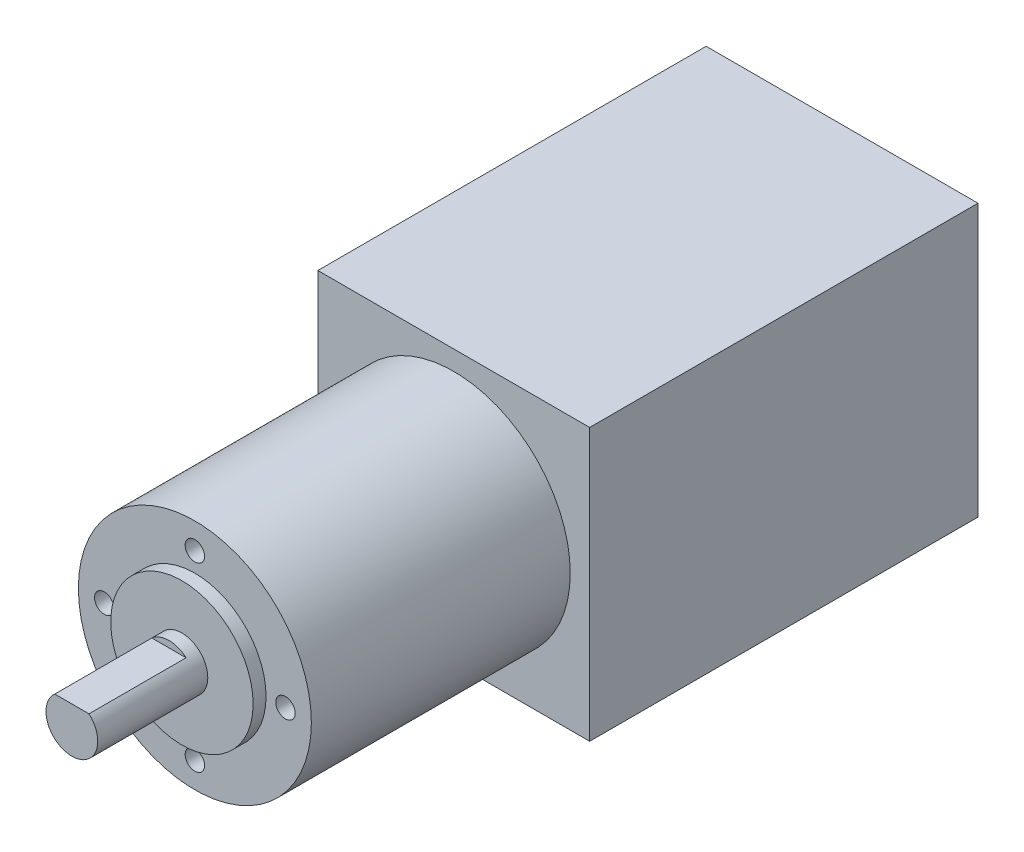
ISO-10303-21;
HEADER;
FILE_DESCRIPTION(('STEP AP214'),'2;1');
FILE_NAME('part.step','',(''),(''),'','','');
FILE_SCHEMA(('AUTOMOTIVE_DESIGN { 1 0 10303 214 1 1 1 1 }'));
ENDSEC;
DATA;
#1=APPLICATION_CONTEXT('core data for automotive mechanical design processes');
#2=APPLICATION_PROTOCOL_DEFINITION('international standard','automotive_design',2000,#1);
#3=PRODUCT_CONTEXT('',#1,'mechanical');
#4=PRODUCT('Part','Part','',(#3));
#5=PRODUCT_RELATED_PRODUCT_CATEGORY('part','',(#4));
#6=PRODUCT_DEFINITION_FORMATION('','',#4);
#7=PRODUCT_DEFINITION_CONTEXT('part definition',#1,'design');
#8=PRODUCT_DEFINITION('design','',#6,#7);
#9=PRODUCT_DEFINITION_SHAPE('','',#8);
#10=(LENGTH_UNIT() NAMED_UNIT(*) SI_UNIT(.MILLI.,.METRE.));
#11=(NAMED_UNIT(*) PLANE_ANGLE_UNIT() SI_UNIT($,.RADIAN.));
#12=(NAMED_UNIT(*) SI_UNIT($,.STERADIAN.) SOLID_ANGLE_UNIT());
#13=UNCERTAINTY_MEASURE_WITH_UNIT(LENGTH_MEASURE(1.E-05),#10,'distance_accuracy_value','');
#14=(GEOMETRIC_REPRESENTATION_CONTEXT(3) GLOBAL_UNCERTAINTY_ASSIGNED_CONTEXT((#13)) GLOBAL_UNIT_ASSIGNED_CONTEXT((#10,
#11,#12)) REPRESENTATION_CONTEXT('',''));
#15=CARTESIAN_POINT('',(0.,0.,0.));
#16=DIRECTION('',(0.,0.,1.));
#17=DIRECTION('',(1.,0.,0.));
#18=AXIS2_PLACEMENT_3D('',#15,#16,#17);
#19=CARTESIAN_POINT('',(21.,21.,60.));
#20=DIRECTION('',(-1.,0.,0.));
#21=DIRECTION('',(0.,-1.,0.));
#22=AXIS2_PLACEMENT_3D('',#19,#20,#21);
#23=PLANE('',#22);
#24=DIRECTION('',(0.,1.,0.));
#25=VECTOR('',#24,1.);
#26=CARTESIAN_POINT('',(21.,21.,0.));
#27=LINE('',#26,#25);
#28=CARTESIAN_POINT('',(21.,-21.,0.));
#29=VERTEX_POINT('',#28);
#30=CARTESIAN_POINT('',(21.,21.,0.));
#31=VERTEX_POINT('',#30);
#32=EDGE_CURVE('E154',#29,#31,#27,.T.);
#33=ORIENTED_EDGE('',*,*,#32,.T.);
#34=DIRECTION('',(0.,0.,-1.));
#35=VECTOR('',#34,1.);
#36=CARTESIAN_POINT('',(21.,21.,60.));
#37=LINE('',#36,#35);
#38=CARTESIAN_POINT('',(21.,21.,60.));
#39=VERTEX_POINT('',#38);
#40=EDGE_CURVE('E39',#39,#31,#37,.T.);
#41=ORIENTED_EDGE('',*,*,#40,.F.);
#42=DIRECTION('',(0.,1.,0.));
#43=VECTOR('',#42,1.);
#44=CARTESIAN_POINT('',(21.,21.,60.));
#45=LINE('',#44,#43);
#46=CARTESIAN_POINT('',(21.,-21.,60.));
#47=VERTEX_POINT('',#46);
#48=EDGE_CURVE('E157',#47,#39,#45,.T.);
#49=ORIENTED_EDGE('',*,*,#48,.F.);
#50=DIRECTION('',(0.,0.,-1.));
#51=VECTOR('',#50,1.);
#52=CARTESIAN_POINT('',(21.,-21.,60.));
#53=LINE('',#52,#51);
#54=EDGE_CURVE('E163',#47,#29,#53,.T.);
#55=ORIENTED_EDGE('',*,*,#54,.T.);
#56=EDGE_LOOP('',(#33,#41,#49,#55));
#57=FACE_BOUND('',#56,.T.);
#58=ADVANCED_FACE('F36',(#57),#23,.F.);
#59=CARTESIAN_POINT('',(-21.,21.,60.));
#60=DIRECTION('',(0.,-1.,0.));
#61=DIRECTION('',(0.,0.,-1.));
#62=AXIS2_PLACEMENT_3D('',#59,#60,#61);
#63=PLANE('',#62);
#64=DIRECTION('',(-1.,0.,0.));
#65=VECTOR('',#64,1.);
#66=CARTESIAN_POINT('',(-21.,21.,0.));
#67=LINE('',#66,#65);
#68=CARTESIAN_POINT('',(-21.,21.,0.));
#69=VERTEX_POINT('',#68);
#70=EDGE_CURVE('E166',#31,#69,#67,.T.);
#71=ORIENTED_EDGE('',*,*,#70,.T.);
#72=DIRECTION('',(0.,0.,-1.));
#73=VECTOR('',#72,1.);
#74=CARTESIAN_POINT('',(-21.,21.,60.));
#75=LINE('',#74,#73);
#76=CARTESIAN_POINT('',(-21.,21.,60.));
#77=VERTEX_POINT('',#76);
#78=EDGE_CURVE('E173',#77,#69,#75,.T.);
#79=ORIENTED_EDGE('',*,*,#78,.F.);
#80=DIRECTION('',(-1.,0.,0.));
#81=VECTOR('',#80,1.);
#82=CARTESIAN_POINT('',(-21.,21.,60.));
#83=LINE('',#82,#81);
#84=EDGE_CURVE('E90',#39,#77,#83,.T.);
#85=ORIENTED_EDGE('',*,*,#84,.F.);
#86=ORIENTED_EDGE('',*,*,#40,.T.);
#87=EDGE_LOOP('',(#71,#79,#85,#86));
#88=FACE_BOUND('',#87,.T.);
#89=ADVANCED_FACE('F179',(#88),#63,.F.);
#90=CARTESIAN_POINT('',(-21.,21.,60.));
#91=DIRECTION('',(1.,0.,0.));
#92=DIRECTION('',(0.,1.,0.));
#93=AXIS2_PLACEMENT_3D('',#90,#91,#92);
#94=PLANE('',#93);
#95=DIRECTION('',(0.,-1.,0.));
#96=VECTOR('',#95,1.);
#97=CARTESIAN_POINT('',(-21.,21.,0.));
#98=LINE('',#97,#96);
#99=CARTESIAN_POINT('',(-21.,-21.,0.));
#100=VERTEX_POINT('',#99);
#101=EDGE_CURVE('E168',#69,#100,#98,.T.);
#102=ORIENTED_EDGE('',*,*,#101,.T.);
#103=DIRECTION('',(0.,0.,-1.));
#104=VECTOR('',#103,1.);
#105=CARTESIAN_POINT('',(-21.,-21.,60.));
#106=LINE('',#105,#104);
#107=CARTESIAN_POINT('',(-21.,-21.,60.));
#108=VERTEX_POINT('',#107);
#109=EDGE_CURVE('E172',#108,#100,#106,.T.);
#110=ORIENTED_EDGE('',*,*,#109,.F.);
#111=DIRECTION('',(0.,-1.,0.));
#112=VECTOR('',#111,1.);
#113=CARTESIAN_POINT('',(-21.,21.,60.));
#114=LINE('',#113,#112);
#115=EDGE_CURVE('E160',#77,#108,#114,.T.);
#116=ORIENTED_EDGE('',*,*,#115,.F.);
#117=ORIENTED_EDGE('',*,*,#78,.T.);
#118=EDGE_LOOP('',(#102,#110,#116,#117));
#119=FACE_BOUND('',#118,.T.);
#120=ADVANCED_FACE('F186',(#119),#94,.F.);
#121=CARTESIAN_POINT('',(-21.,-21.,60.));
#122=DIRECTION('',(0.,1.,0.));
#123=DIRECTION('',(0.,0.,1.));
#124=AXIS2_PLACEMENT_3D('',#121,#122,#123);
#125=PLANE('',#124);
#126=DIRECTION('',(1.,0.,0.));
#127=VECTOR('',#126,1.);
#128=CARTESIAN_POINT('',(-21.,-21.,0.));
#129=LINE('',#128,#127);
#130=EDGE_CURVE('E82',#100,#29,#129,.T.);
#131=ORIENTED_EDGE('',*,*,#130,.T.);
#132=ORIENTED_EDGE('',*,*,#54,.F.);
#133=DIRECTION('',(1.,0.,0.));
#134=VECTOR('',#133,1.);
#135=CARTESIAN_POINT('',(-21.,-21.,60.));
#136=LINE('',#135,#134);
#137=EDGE_CURVE('E61',#108,#47,#136,.T.);
#138=ORIENTED_EDGE('',*,*,#137,.F.);
#139=ORIENTED_EDGE('',*,*,#109,.T.);
#140=EDGE_LOOP('',(#131,#132,#138,#139));
#141=FACE_BOUND('',#140,.T.);
#142=ADVANCED_FACE('F187',(#141),#125,.F.);
#143=CARTESIAN_POINT('',(0.,0.,60.));
#144=DIRECTION('',(0.,0.,1.));
#145=DIRECTION('',(1.,0.,0.));
#146=AXIS2_PLACEMENT_3D('',#143,#144,#145);
#147=PLANE('',#146);
#148=CARTESIAN_POINT('',(0.,0.,60.));
#149=DIRECTION('',(0.,0.,1.));
#150=DIRECTION('',(1.,0.,0.));
#151=AXIS2_PLACEMENT_3D('',#148,#149,#150);
#152=CIRCLE('',#151,18.);
#153=CARTESIAN_POINT('',(18.,0.,60.));
#154=VERTEX_POINT('',#153);
#155=EDGE_CURVE('E151',#154,#154,#152,.T.);
#156=ORIENTED_EDGE('',*,*,#155,.F.);
#157=EDGE_LOOP('',(#156));
#158=FACE_BOUND('',#157,.T.);
#159=ORIENTED_EDGE('',*,*,#48,.T.);
#160=ORIENTED_EDGE('',*,*,#84,.T.);
#161=ORIENTED_EDGE('',*,*,#115,.T.);
#162=ORIENTED_EDGE('',*,*,#137,.T.);
#163=EDGE_LOOP('',(#159,#160,#161,#162));
#164=FACE_BOUND('',#163,.T.);
#165=ADVANCED_FACE('F188',(#158,#164),#147,.T.);
#166=CARTESIAN_POINT('',(0.,0.,0.));
#167=DIRECTION('',(0.,0.,1.));
#168=DIRECTION('',(1.,0.,0.));
#169=AXIS2_PLACEMENT_3D('',#166,#167,#168);
#170=PLANE('',#169);
#171=ORIENTED_EDGE('',*,*,#32,.F.);
#172=ORIENTED_EDGE('',*,*,#130,.F.);
#173=ORIENTED_EDGE('',*,*,#101,.F.);
#174=ORIENTED_EDGE('',*,*,#70,.F.);
#175=EDGE_LOOP('',(#171,#172,#173,#174));
#176=FACE_BOUND('',#175,.T.);
#177=ADVANCED_FACE('F184',(#176),#170,.F.);
#178=CARTESIAN_POINT('',(0.,0.,100.));
#179=DIRECTION('',(0.,0.,-1.));
#180=DIRECTION('',(-1.,0.,0.));
#181=AXIS2_PLACEMENT_3D('',#178,#179,#180);
#182=CYLINDRICAL_SURFACE('',#181,18.);
#183=CARTESIAN_POINT('',(0.,0.,100.));
#184=DIRECTION('',(0.,0.,1.));
#185=DIRECTION('',(1.,0.,0.));
#186=AXIS2_PLACEMENT_3D('',#183,#184,#185);
#187=CIRCLE('',#186,18.);
#188=CARTESIAN_POINT('',(18.,0.,100.));
#189=VERTEX_POINT('',#188);
#190=EDGE_CURVE('E148',#189,#189,#187,.T.);
#191=ORIENTED_EDGE('',*,*,#190,.F.);
#192=EDGE_LOOP('',(#191));
#193=FACE_BOUND('',#192,.T.);
#194=ORIENTED_EDGE('',*,*,#155,.T.);
#195=EDGE_LOOP('',(#194));
#196=FACE_BOUND('',#195,.T.);
#197=ADVANCED_FACE('F196',(#193,#196),#182,.T.);
#198=CARTESIAN_POINT('',(0.,0.,100.));
#199=DIRECTION('',(0.,0.,1.));
#200=DIRECTION('',(1.,0.,0.));
#201=AXIS2_PLACEMENT_3D('',#198,#199,#200);
#202=PLANE('',#201);
#203=CARTESIAN_POINT('',(0.,14.,100.));
#204=DIRECTION('',(0.,0.,1.));
#205=DIRECTION('',(1.,0.,0.));
#206=AXIS2_PLACEMENT_3D('',#203,#204,#205);
#207=CIRCLE('',#206,1.5);
#208=CARTESIAN_POINT('',(1.5,14.,100.));
#209=VERTEX_POINT('',#208);
#210=EDGE_CURVE('E124',#209,#209,#207,.T.);
#211=ORIENTED_EDGE('',*,*,#210,.F.);
#212=EDGE_LOOP('',(#211));
#213=FACE_BOUND('',#212,.T.);
#214=CARTESIAN_POINT('',(14.0000000000004,3.95332173747447E-13,100.));
#215=DIRECTION('',(0.,0.,1.));
#216=DIRECTION('',(1.,0.,0.));
#217=AXIS2_PLACEMENT_3D('',#214,#215,#216);
#218=CIRCLE('',#217,1.50000000000031);
#219=CARTESIAN_POINT('',(15.5000000000007,3.95332173747447E-13,100.));
#220=VERTEX_POINT('',#219);
#221=EDGE_CURVE('E130',#220,#220,#218,.T.);
#222=ORIENTED_EDGE('',*,*,#221,.F.);
#223=EDGE_LOOP('',(#222));
#224=FACE_BOUND('',#223,.T.);
#225=CARTESIAN_POINT('',(7.90664347494893E-13,-14.,100.));
#226=DIRECTION('',(0.,0.,1.));
#227=DIRECTION('',(1.,0.,0.));
#228=AXIS2_PLACEMENT_3D('',#225,#226,#227);
#229=CIRCLE('',#228,1.50000000000085);
#230=CARTESIAN_POINT('',(1.50000000000164,-14.,100.));
#231=VERTEX_POINT('',#230);
#232=EDGE_CURVE('E136',#231,#231,#229,.T.);
#233=ORIENTED_EDGE('',*,*,#232,.F.);
#234=EDGE_LOOP('',(#233));
#235=FACE_BOUND('',#234,.T.);
#236=CARTESIAN_POINT('',(-13.9999999999996,-3.97046679266253E-13,100.));
#237=DIRECTION('',(0.,0.,1.));
#238=DIRECTION('',(1.,0.,0.));
#239=AXIS2_PLACEMENT_3D('',#236,#237,#238);
#240=CIRCLE('',#239,1.50000000000064);
#241=CARTESIAN_POINT('',(-12.499999999999,-3.97046679266253E-13,100.));
#242=VERTEX_POINT('',#241);
#243=EDGE_CURVE('E117',#242,#242,#240,.T.);
#244=ORIENTED_EDGE('',*,*,#243,.F.);
#245=EDGE_LOOP('',(#244));
#246=FACE_BOUND('',#245,.T.);
#247=CARTESIAN_POINT('',(0.,0.,100.));
#248=DIRECTION('',(0.,0.,1.));
#249=DIRECTION('',(1.,0.,0.));
#250=AXIS2_PLACEMENT_3D('',#247,#248,#249);
#251=CIRCLE('',#250,11.);
#252=CARTESIAN_POINT('',(11.,0.,100.));
#253=VERTEX_POINT('',#252);
#254=EDGE_CURVE('E44',#253,#253,#251,.T.);
#255=ORIENTED_EDGE('',*,*,#254,.F.);
#256=EDGE_LOOP('',(#255));
#257=FACE_BOUND('',#256,.T.);
#258=ORIENTED_EDGE('',*,*,#190,.T.);
#259=EDGE_LOOP('',(#258));
#260=FACE_BOUND('',#259,.T.);
#261=ADVANCED_FACE('F234',(#213,#224,#235,#246,#257,#260),#202,.T.);
#262=CARTESIAN_POINT('',(0.,0.,102.));
#263=DIRECTION('',(0.,0.,-1.));
#264=DIRECTION('',(-1.,0.,0.));
#265=AXIS2_PLACEMENT_3D('',#262,#263,#264);
#266=CYLINDRICAL_SURFACE('',#265,11.);
#267=CARTESIAN_POINT('',(0.,0.,102.));
#268=DIRECTION('',(0.,0.,1.));
#269=DIRECTION('',(1.,0.,0.));
#270=AXIS2_PLACEMENT_3D('',#267,#268,#269);
#271=CIRCLE('',#270,11.);
#272=CARTESIAN_POINT('',(11.,0.,102.));
#273=VERTEX_POINT('',#272);
#274=EDGE_CURVE('E144',#273,#273,#271,.T.);
#275=ORIENTED_EDGE('',*,*,#274,.F.);
#276=EDGE_LOOP('',(#275));
#277=FACE_BOUND('',#276,.T.);
#278=ORIENTED_EDGE('',*,*,#254,.T.);
#279=EDGE_LOOP('',(#278));
#280=FACE_BOUND('',#279,.T.);
#281=ADVANCED_FACE('F241',(#277,#280),#266,.T.);
#282=CARTESIAN_POINT('',(0.,0.,102.));
#283=DIRECTION('',(0.,0.,1.));
#284=DIRECTION('',(1.,0.,0.));
#285=AXIS2_PLACEMENT_3D('',#282,#283,#284);
#286=PLANE('',#285);
#287=CARTESIAN_POINT('',(0.,0.,102.));
#288=DIRECTION('',(0.,0.,1.));
#289=DIRECTION('',(1.,0.,0.));
#290=AXIS2_PLACEMENT_3D('',#287,#288,#289);
#291=CIRCLE('',#290,4.);
#292=CARTESIAN_POINT('',(4.,0.,102.));
#293=VERTEX_POINT('',#292);
#294=EDGE_CURVE('E11',#293,#293,#291,.T.);
#295=ORIENTED_EDGE('',*,*,#294,.F.);
#296=EDGE_LOOP('',(#295));
#297=FACE_BOUND('',#296,.T.);
#298=ORIENTED_EDGE('',*,*,#274,.T.);
#299=EDGE_LOOP('',(#298));
#300=FACE_BOUND('',#299,.T.);
#301=ADVANCED_FACE('F246',(#297,#300),#286,.T.);
#302=CARTESIAN_POINT('',(0.,0.,119.));
#303=DIRECTION('',(0.,0.,-1.));
#304=DIRECTION('',(-1.,0.,0.));
#305=AXIS2_PLACEMENT_3D('',#302,#303,#304);
#306=CYLINDRICAL_SURFACE('',#305,4.);
#307=CARTESIAN_POINT('',(0.,0.,119.));
#308=DIRECTION('',(0.,0.,1.));
#309=DIRECTION('',(1.,0.,0.));
#310=AXIS2_PLACEMENT_3D('',#307,#308,#309);
#311=CIRCLE('',#310,4.);
#312=CARTESIAN_POINT('',(-2.64575131106459,3.,119.));
#313=VERTEX_POINT('',#312);
#314=CARTESIAN_POINT('',(2.64575131106459,3.,119.));
#315=VERTEX_POINT('',#314);
#316=EDGE_CURVE('E115',#313,#315,#311,.T.);
#317=ORIENTED_EDGE('',*,*,#316,.F.);
#318=DIRECTION('',(0.,0.,1.));
#319=VECTOR('',#318,1.);
#320=CARTESIAN_POINT('',(-2.64575131106459,3.,104.));
#321=LINE('',#320,#319);
#322=CARTESIAN_POINT('',(-2.64575131106459,3.,104.));
#323=VERTEX_POINT('',#322);
#324=EDGE_CURVE('E52',#323,#313,#321,.T.);
#325=ORIENTED_EDGE('',*,*,#324,.F.);
#326=CARTESIAN_POINT('',(0.,0.,104.));
#327=DIRECTION('',(0.,0.,1.));
#328=DIRECTION('',(-1.,0.,0.));
#329=AXIS2_PLACEMENT_3D('',#326,#327,#328);
#330=CIRCLE('',#329,4.);
#331=CARTESIAN_POINT('',(2.64575131106459,3.,104.));
#332=VERTEX_POINT('',#331);
#333=EDGE_CURVE('E101',#332,#323,#330,.T.);
#334=ORIENTED_EDGE('',*,*,#333,.F.);
#335=DIRECTION('',(0.,0.,1.));
#336=VECTOR('',#335,1.);
#337=CARTESIAN_POINT('',(2.64575131106459,3.,104.));
#338=LINE('',#337,#336);
#339=EDGE_CURVE('E109',#332,#315,#338,.T.);
#340=ORIENTED_EDGE('',*,*,#339,.T.);
#341=EDGE_LOOP('',(#317,#325,#334,#340));
#342=FACE_BOUND('',#341,.T.);
#343=ORIENTED_EDGE('',*,*,#294,.T.);
#344=EDGE_LOOP('',(#343));
#345=FACE_BOUND('',#344,.T.);
#346=ADVANCED_FACE('F112',(#342,#345),#306,.T.);
#347=CARTESIAN_POINT('',(0.,0.,119.));
#348=DIRECTION('',(0.,0.,1.));
#349=DIRECTION('',(1.,0.,0.));
#350=AXIS2_PLACEMENT_3D('',#347,#348,#349);
#351=PLANE('',#350);
#352=DIRECTION('',(1.,0.,0.));
#353=VECTOR('',#352,1.);
#354=CARTESIAN_POINT('',(2.64575131106459,3.,119.));
#355=LINE('',#354,#353);
#356=EDGE_CURVE('E106',#313,#315,#355,.T.);
#357=ORIENTED_EDGE('',*,*,#356,.F.);
#358=ORIENTED_EDGE('',*,*,#316,.T.);
#359=EDGE_LOOP('',(#357,#358));
#360=FACE_BOUND('',#359,.T.);
#361=ADVANCED_FACE('F276',(#360),#351,.T.);
#362=CARTESIAN_POINT('',(-13.9999999999996,-3.97046679266253E-13,96.));
#363=DIRECTION('',(0.,0.,1.));
#364=DIRECTION('',(1.,0.,0.));
#365=AXIS2_PLACEMENT_3D('',#362,#363,#364);
#366=CYLINDRICAL_SURFACE('',#365,1.50000000000064);
#367=CARTESIAN_POINT('',(-13.9999999999996,-3.97046679266253E-13,96.));
#368=DIRECTION('',(0.,0.,1.));
#369=DIRECTION('',(1.,0.,0.));
#370=AXIS2_PLACEMENT_3D('',#367,#368,#369);
#371=CIRCLE('',#370,1.50000000000064);
#372=CARTESIAN_POINT('',(-12.499999999999,-3.97046679266253E-13,96.));
#373=VERTEX_POINT('',#372);
#374=EDGE_CURVE('E139',#373,#373,#371,.T.);
#375=ORIENTED_EDGE('',*,*,#374,.F.);
#376=EDGE_LOOP('',(#375));
#377=FACE_BOUND('',#376,.T.);
#378=ORIENTED_EDGE('',*,*,#243,.T.);
#379=EDGE_LOOP('',(#378));
#380=FACE_BOUND('',#379,.T.);
#381=ADVANCED_FACE('F270',(#377,#380),#366,.F.);
#382=CARTESIAN_POINT('',(-13.9999999999996,-3.97046679266253E-13,96.));
#383=DIRECTION('',(0.,0.,1.));
#384=DIRECTION('',(1.,0.,0.));
#385=AXIS2_PLACEMENT_3D('',#382,#383,#384);
#386=PLANE('',#385);
#387=ORIENTED_EDGE('',*,*,#374,.T.);
#388=EDGE_LOOP('',(#387));
#389=FACE_BOUND('',#388,.T.);
#390=ADVANCED_FACE('F275',(#389),#386,.T.);
#391=CARTESIAN_POINT('',(7.90664347494893E-13,-14.,96.));
#392=DIRECTION('',(0.,0.,1.));
#393=DIRECTION('',(1.,0.,0.));
#394=AXIS2_PLACEMENT_3D('',#391,#392,#393);
#395=CYLINDRICAL_SURFACE('',#394,1.50000000000085);
#396=CARTESIAN_POINT('',(7.90664347494893E-13,-14.,96.));
#397=DIRECTION('',(0.,0.,1.));
#398=DIRECTION('',(1.,0.,0.));
#399=AXIS2_PLACEMENT_3D('',#396,#397,#398);
#400=CIRCLE('',#399,1.50000000000085);
#401=CARTESIAN_POINT('',(1.50000000000164,-14.,96.));
#402=VERTEX_POINT('',#401);
#403=EDGE_CURVE('E133',#402,#402,#400,.T.);
#404=ORIENTED_EDGE('',*,*,#403,.F.);
#405=EDGE_LOOP('',(#404));
#406=FACE_BOUND('',#405,.T.);
#407=ORIENTED_EDGE('',*,*,#232,.T.);
#408=EDGE_LOOP('',(#407));
#409=FACE_BOUND('',#408,.T.);
#410=ADVANCED_FACE('F288',(#406,#409),#395,.F.);
#411=CARTESIAN_POINT('',(7.90664347494893E-13,-14.,96.));
#412=DIRECTION('',(0.,0.,1.));
#413=DIRECTION('',(1.,0.,0.));
#414=AXIS2_PLACEMENT_3D('',#411,#412,#413);
#415=PLANE('',#414);
#416=ORIENTED_EDGE('',*,*,#403,.T.);
#417=EDGE_LOOP('',(#416));
#418=FACE_BOUND('',#417,.T.);
#419=ADVANCED_FACE('F298',(#418),#415,.T.);
#420=CARTESIAN_POINT('',(14.0000000000004,3.95332173747447E-13,96.));
#421=DIRECTION('',(0.,0.,1.));
#422=DIRECTION('',(1.,0.,0.));
#423=AXIS2_PLACEMENT_3D('',#420,#421,#422);
#424=CYLINDRICAL_SURFACE('',#423,1.50000000000031);
#425=CARTESIAN_POINT('',(14.0000000000004,3.95332173747447E-13,96.));
#426=DIRECTION('',(0.,0.,1.));
#427=DIRECTION('',(1.,0.,0.));
#428=AXIS2_PLACEMENT_3D('',#425,#426,#427);
#429=CIRCLE('',#428,1.50000000000031);
#430=CARTESIAN_POINT('',(15.5000000000007,3.95332173747447E-13,96.));
#431=VERTEX_POINT('',#430);
#432=EDGE_CURVE('E127',#431,#431,#429,.T.);
#433=ORIENTED_EDGE('',*,*,#432,.F.);
#434=EDGE_LOOP('',(#433));
#435=FACE_BOUND('',#434,.T.);
#436=ORIENTED_EDGE('',*,*,#221,.T.);
#437=EDGE_LOOP('',(#436));
#438=FACE_BOUND('',#437,.T.);
#439=ADVANCED_FACE('F308',(#435,#438),#424,.F.);
#440=CARTESIAN_POINT('',(14.0000000000004,3.95332173747447E-13,96.));
#441=DIRECTION('',(0.,0.,1.));
#442=DIRECTION('',(1.,0.,0.));
#443=AXIS2_PLACEMENT_3D('',#440,#441,#442);
#444=PLANE('',#443);
#445=ORIENTED_EDGE('',*,*,#432,.T.);
#446=EDGE_LOOP('',(#445));
#447=FACE_BOUND('',#446,.T.);
#448=ADVANCED_FACE('F318',(#447),#444,.T.);
#449=CARTESIAN_POINT('',(0.,14.,96.));
#450=DIRECTION('',(0.,0.,1.));
#451=DIRECTION('',(1.,0.,0.));
#452=AXIS2_PLACEMENT_3D('',#449,#450,#451);
#453=CYLINDRICAL_SURFACE('',#452,1.5);
#454=CARTESIAN_POINT('',(0.,14.,96.));
#455=DIRECTION('',(0.,0.,1.));
#456=DIRECTION('',(1.,0.,0.));
#457=AXIS2_PLACEMENT_3D('',#454,#455,#456);
#458=CIRCLE('',#457,1.5);
#459=CARTESIAN_POINT('',(1.5,14.,96.));
#460=VERTEX_POINT('',#459);
#461=EDGE_CURVE('E121',#460,#460,#458,.T.);
#462=ORIENTED_EDGE('',*,*,#461,.F.);
#463=EDGE_LOOP('',(#462));
#464=FACE_BOUND('',#463,.T.);
#465=ORIENTED_EDGE('',*,*,#210,.T.);
#466=EDGE_LOOP('',(#465));
#467=FACE_BOUND('',#466,.T.);
#468=ADVANCED_FACE('F328',(#464,#467),#453,.F.);
#469=CARTESIAN_POINT('',(0.,14.,96.));
#470=DIRECTION('',(0.,0.,1.));
#471=DIRECTION('',(1.,0.,0.));
#472=AXIS2_PLACEMENT_3D('',#469,#470,#471);
#473=PLANE('',#472);
#474=ORIENTED_EDGE('',*,*,#461,.T.);
#475=EDGE_LOOP('',(#474));
#476=FACE_BOUND('',#475,.T.);
#477=ADVANCED_FACE('F338',(#476),#473,.T.);
#478=CARTESIAN_POINT('',(2.64575131106459,3.,104.));
#479=DIRECTION('',(0.,-1.,0.));
#480=DIRECTION('',(0.,0.,-1.));
#481=AXIS2_PLACEMENT_3D('',#478,#479,#480);
#482=PLANE('',#481);
#483=ORIENTED_EDGE('',*,*,#356,.T.);
#484=ORIENTED_EDGE('',*,*,#339,.F.);
#485=DIRECTION('',(1.,0.,0.));
#486=VECTOR('',#485,1.);
#487=CARTESIAN_POINT('',(2.64575131106459,3.,104.));
#488=LINE('',#487,#486);
#489=EDGE_CURVE('E103',#323,#332,#488,.T.);
#490=ORIENTED_EDGE('',*,*,#489,.F.);
#491=ORIENTED_EDGE('',*,*,#324,.T.);
#492=EDGE_LOOP('',(#483,#484,#490,#491));
#493=FACE_BOUND('',#492,.T.);
#494=ADVANCED_FACE('F108',(#493),#482,.F.);
#495=CARTESIAN_POINT('',(0.,0.,104.));
#496=DIRECTION('',(0.,0.,-1.));
#497=DIRECTION('',(-1.,0.,0.));
#498=AXIS2_PLACEMENT_3D('',#495,#496,#497);
#499=PLANE('',#498);
#500=ORIENTED_EDGE('',*,*,#333,.T.);
#501=ORIENTED_EDGE('',*,*,#489,.T.);
#502=EDGE_LOOP('',(#500,#501));
#503=FACE_BOUND('',#502,.T.);
#504=ADVANCED_FACE('F102',(#503),#499,.F.);
#505=CLOSED_SHELL('',(#58,#89,#120,#142,#165,#177,#197,#261,#281,#301,#346,#361,#381,#390,#410,
#419,#439,#448,#468,#477,#494,#504));
#506=MANIFOLD_SOLID_BREP('B2',#505);
#507=ADVANCED_BREP_SHAPE_REPRESENTATION('',(#18,#506),#14);
#508=SHAPE_DEFINITION_REPRESENTATION(#9,#507);
ENDSEC;
END-ISO-10303-21;
